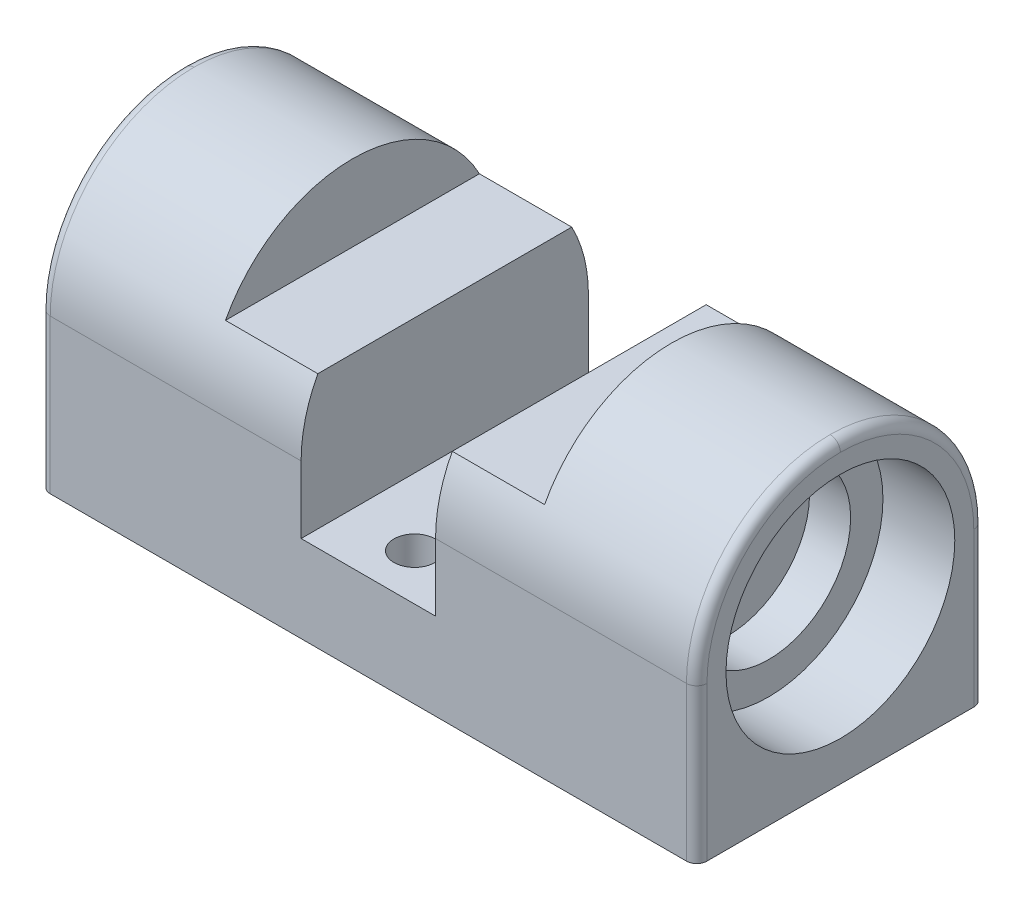
ISO-10303-21;
HEADER;
FILE_DESCRIPTION(('STEP AP214'),'2;1');
FILE_NAME('part.step','',(''),(''),'','','');
FILE_SCHEMA(('AUTOMOTIVE_DESIGN { 1 0 10303 214 1 1 1 1 }'));
ENDSEC;
DATA;
#1=APPLICATION_CONTEXT('core data for automotive mechanical design processes');
#2=APPLICATION_PROTOCOL_DEFINITION('international standard','automotive_design',2000,#1);
#3=PRODUCT_CONTEXT('',#1,'mechanical');
#4=PRODUCT('Part','Part','',(#3));
#5=PRODUCT_RELATED_PRODUCT_CATEGORY('part','',(#4));
#6=PRODUCT_DEFINITION_FORMATION('','',#4);
#7=PRODUCT_DEFINITION_CONTEXT('part definition',#1,'design');
#8=PRODUCT_DEFINITION('design','',#6,#7);
#9=PRODUCT_DEFINITION_SHAPE('','',#8);
#10=(LENGTH_UNIT() NAMED_UNIT(*) SI_UNIT(.MILLI.,.METRE.));
#11=(NAMED_UNIT(*) PLANE_ANGLE_UNIT() SI_UNIT($,.RADIAN.));
#12=(NAMED_UNIT(*) SI_UNIT($,.STERADIAN.) SOLID_ANGLE_UNIT());
#13=UNCERTAINTY_MEASURE_WITH_UNIT(LENGTH_MEASURE(1.E-05),#10,'distance_accuracy_value','');
#14=(GEOMETRIC_REPRESENTATION_CONTEXT(3) GLOBAL_UNCERTAINTY_ASSIGNED_CONTEXT((#13)) GLOBAL_UNIT_ASSIGNED_CONTEXT((#10,
#11,#12)) REPRESENTATION_CONTEXT('',''));
#15=CARTESIAN_POINT('',(0.,0.,0.));
#16=DIRECTION('',(0.,0.,1.));
#17=DIRECTION('',(1.,0.,0.));
#18=AXIS2_PLACEMENT_3D('',#15,#16,#17);
#19=CARTESIAN_POINT('',(0.,13.,0.));
#20=DIRECTION('',(1.,0.,0.));
#21=DIRECTION('',(0.,0.,-1.));
#22=AXIS2_PLACEMENT_3D('',#19,#20,#21);
#23=CYLINDRICAL_SURFACE('',#22,14.);
#24=DIRECTION('',(-1.,0.,0.));
#25=VECTOR('',#24,1.);
#26=CARTESIAN_POINT('',(32.,13.,-14.));
#27=LINE('',#26,#25);
#28=CARTESIAN_POINT('',(6.55,13.,-14.));
#29=VERTEX_POINT('',#28);
#30=CARTESIAN_POINT('',(31.,13.,-14.));
#31=VERTEX_POINT('',#30);
#32=EDGE_CURVE('E255',#29,#31,#27,.F.);
#33=ORIENTED_EDGE('',*,*,#32,.F.);
#34=CARTESIAN_POINT('',(6.55,13.,0.));
#35=DIRECTION('',(-1.,0.,0.));
#36=DIRECTION('',(0.,-1.,0.));
#37=AXIS2_PLACEMENT_3D('',#34,#35,#36);
#38=CIRCLE('',#37,14.);
#39=CARTESIAN_POINT('',(6.55,19.55,-12.3732574530719));
#40=VERTEX_POINT('',#39);
#41=EDGE_CURVE('E348',#29,#40,#38,.F.);
#42=ORIENTED_EDGE('',*,*,#41,.T.);
#43=DIRECTION('',(1.,0.,0.));
#44=VECTOR('',#43,1.);
#45=CARTESIAN_POINT('',(0.,19.55,-12.3732574530719));
#46=LINE('',#45,#44);
#47=CARTESIAN_POINT('',(15.5472418092629,19.55,-12.3732574530719));
#48=VERTEX_POINT('',#47);
#49=EDGE_CURVE('E341',#40,#48,#46,.T.);
#50=ORIENTED_EDGE('',*,*,#49,.T.);
#51=CARTESIAN_POINT('',(15.5472418092629,13.,0.));
#52=DIRECTION('',(-1.,0.,0.));
#53=DIRECTION('',(0.,0.,1.));
#54=AXIS2_PLACEMENT_3D('',#51,#52,#53);
#55=CIRCLE('',#54,14.);
#56=CARTESIAN_POINT('',(15.5472418092629,19.55,12.3732574530719));
#57=VERTEX_POINT('',#56);
#58=EDGE_CURVE('E313',#48,#57,#55,.F.);
#59=ORIENTED_EDGE('',*,*,#58,.T.);
#60=DIRECTION('',(1.,0.,0.));
#61=VECTOR('',#60,1.);
#62=CARTESIAN_POINT('',(0.,19.55,12.3732574530719));
#63=LINE('',#62,#61);
#64=CARTESIAN_POINT('',(6.55,19.55,12.3732574530719));
#65=VERTEX_POINT('',#64);
#66=EDGE_CURVE('E344',#57,#65,#63,.F.);
#67=ORIENTED_EDGE('',*,*,#66,.T.);
#68=CARTESIAN_POINT('',(6.55,13.,14.));
#69=VERTEX_POINT('',#68);
#70=EDGE_CURVE('E347',#65,#69,#38,.F.);
#71=ORIENTED_EDGE('',*,*,#70,.T.);
#72=DIRECTION('',(1.,0.,0.));
#73=VECTOR('',#72,1.);
#74=CARTESIAN_POINT('',(-32.,13.,14.));
#75=LINE('',#74,#73);
#76=CARTESIAN_POINT('',(31.,13.,14.));
#77=VERTEX_POINT('',#76);
#78=EDGE_CURVE('E59',#77,#69,#75,.F.);
#79=ORIENTED_EDGE('',*,*,#78,.F.);
#80=CARTESIAN_POINT('',(31.,13.,0.));
#81=DIRECTION('',(-1.,0.,0.));
#82=DIRECTION('',(0.,0.,1.));
#83=AXIS2_PLACEMENT_3D('',#80,#81,#82);
#84=CIRCLE('',#83,14.);
#85=CARTESIAN_POINT('',(31.,27.,0.));
#86=VERTEX_POINT('',#85);
#87=EDGE_CURVE('E306',#77,#86,#84,.T.);
#88=ORIENTED_EDGE('',*,*,#87,.T.);
#89=DIRECTION('',(1.,0.,0.));
#90=VECTOR('',#89,1.);
#91=CARTESIAN_POINT('',(32.,27.,0.));
#92=LINE('',#91,#90);
#93=CARTESIAN_POINT('',(21.25,27.,0.));
#94=VERTEX_POINT('',#93);
#95=EDGE_CURVE('E262',#94,#86,#92,.T.);
#96=ORIENTED_EDGE('',*,*,#95,.F.);
#97=ORIENTED_EDGE('',*,*,#95,.T.);
#98=CARTESIAN_POINT('',(31.,13.,0.));
#99=DIRECTION('',(-1.,0.,0.));
#100=DIRECTION('',(0.,0.,1.));
#101=AXIS2_PLACEMENT_3D('',#98,#99,#100);
#102=CIRCLE('',#101,14.);
#103=EDGE_CURVE('E303',#86,#31,#102,.T.);
#104=ORIENTED_EDGE('',*,*,#103,.T.);
#105=EDGE_LOOP('',(#33,#42,#50,#59,#67,#71,#79,#88,#96,#97,#104));
#106=FACE_BOUND('',#105,.T.);
#107=ADVANCED_FACE('F35',(#106),#23,.T.);
#108=CARTESIAN_POINT('',(-32.,13.,0.));
#109=DIRECTION('',(1.,0.,0.));
#110=DIRECTION('',(0.,0.,-1.));
#111=AXIS2_PLACEMENT_3D('',#108,#109,#110);
#112=CYLINDRICAL_SURFACE('',#111,8.);
#113=CARTESIAN_POINT('',(-21.,13.,0.));
#114=DIRECTION('',(-1.,0.,0.));
#115=DIRECTION('',(0.,0.,1.));
#116=AXIS2_PLACEMENT_3D('',#113,#114,#115);
#117=CIRCLE('',#116,8.);
#118=CARTESIAN_POINT('',(-21.,13.,8.00000000000001));
#119=VERTEX_POINT('',#118);
#120=EDGE_CURVE('E229',#119,#119,#117,.F.);
#121=ORIENTED_EDGE('',*,*,#120,.T.);
#122=EDGE_LOOP('',(#121));
#123=FACE_BOUND('',#122,.T.);
#124=CARTESIAN_POINT('',(-25.,13.,0.));
#125=DIRECTION('',(-1.,0.,0.));
#126=DIRECTION('',(0.,0.,1.));
#127=AXIS2_PLACEMENT_3D('',#124,#125,#126);
#128=CIRCLE('',#127,8.);
#129=CARTESIAN_POINT('',(-25.,13.,8.00000000000001));
#130=VERTEX_POINT('',#129);
#131=EDGE_CURVE('E228',#130,#130,#128,.T.);
#132=ORIENTED_EDGE('',*,*,#131,.T.);
#133=EDGE_LOOP('',(#132));
#134=FACE_BOUND('',#133,.T.);
#135=ADVANCED_FACE('F379',(#123,#134),#112,.F.);
#136=CARTESIAN_POINT('',(0.,-2.,0.));
#137=DIRECTION('',(0.,-1.,0.));
#138=DIRECTION('',(0.,0.,-1.));
#139=AXIS2_PLACEMENT_3D('',#136,#137,#138);
#140=PLANE('',#139);
#141=CARTESIAN_POINT('',(0.,-2.,-9.5));
#142=DIRECTION('',(0.,-1.,0.));
#143=DIRECTION('',(0.,0.,-1.));
#144=AXIS2_PLACEMENT_3D('',#141,#142,#143);
#145=CIRCLE('',#144,2.);
#146=CARTESIAN_POINT('',(0.,-2.,-11.5));
#147=VERTEX_POINT('',#146);
#148=EDGE_CURVE('E216',#147,#147,#145,.T.);
#149=ORIENTED_EDGE('',*,*,#148,.F.);
#150=EDGE_LOOP('',(#149));
#151=FACE_BOUND('',#150,.T.);
#152=CARTESIAN_POINT('',(0.,-2.,9.5));
#153=DIRECTION('',(0.,-1.,0.));
#154=DIRECTION('',(0.,0.,-1.));
#155=AXIS2_PLACEMENT_3D('',#152,#153,#154);
#156=CIRCLE('',#155,2.);
#157=CARTESIAN_POINT('',(0.,-2.,7.5));
#158=VERTEX_POINT('',#157);
#159=EDGE_CURVE('E220',#158,#158,#156,.T.);
#160=ORIENTED_EDGE('',*,*,#159,.F.);
#161=EDGE_LOOP('',(#160));
#162=FACE_BOUND('',#161,.T.);
#163=CARTESIAN_POINT('',(0.,-2.,0.));
#164=DIRECTION('',(0.,-1.,0.));
#165=DIRECTION('',(0.,0.,-1.));
#166=AXIS2_PLACEMENT_3D('',#163,#164,#165);
#167=CIRCLE('',#166,2.);
#168=CARTESIAN_POINT('',(0.,-2.,-2.));
#169=VERTEX_POINT('',#168);
#170=EDGE_CURVE('E215',#169,#169,#167,.T.);
#171=ORIENTED_EDGE('',*,*,#170,.F.);
#172=EDGE_LOOP('',(#171));
#173=FACE_BOUND('',#172,.T.);
#174=CARTESIAN_POINT('',(31.,-2.,13.));
#175=DIRECTION('',(0.,-1.,0.));
#176=DIRECTION('',(0.,0.,-1.));
#177=AXIS2_PLACEMENT_3D('',#174,#175,#176);
#178=CIRCLE('',#177,1.);
#179=CARTESIAN_POINT('',(32.,-2.,13.));
#180=VERTEX_POINT('',#179);
#181=CARTESIAN_POINT('',(31.,-2.,14.));
#182=VERTEX_POINT('',#181);
#183=EDGE_CURVE('E274',#180,#182,#178,.T.);
#184=ORIENTED_EDGE('',*,*,#183,.T.);
#185=DIRECTION('',(1.,0.,0.));
#186=VECTOR('',#185,1.);
#187=CARTESIAN_POINT('',(21.25,-2.,14.));
#188=LINE('',#187,#186);
#189=CARTESIAN_POINT('',(-31.,-2.,14.));
#190=VERTEX_POINT('',#189);
#191=EDGE_CURVE('E241',#190,#182,#188,.T.);
#192=ORIENTED_EDGE('',*,*,#191,.F.);
#193=CARTESIAN_POINT('',(-31.,-2.,13.));
#194=DIRECTION('',(0.,-1.,0.));
#195=DIRECTION('',(0.,0.,-1.));
#196=AXIS2_PLACEMENT_3D('',#193,#194,#195);
#197=CIRCLE('',#196,1.);
#198=CARTESIAN_POINT('',(-32.,-2.,13.));
#199=VERTEX_POINT('',#198);
#200=EDGE_CURVE('E277',#190,#199,#197,.T.);
#201=ORIENTED_EDGE('',*,*,#200,.T.);
#202=DIRECTION('',(0.,0.,1.));
#203=VECTOR('',#202,1.);
#204=CARTESIAN_POINT('',(-32.,-2.,-14.));
#205=LINE('',#204,#203);
#206=CARTESIAN_POINT('',(-32.,-2.,-13.));
#207=VERTEX_POINT('',#206);
#208=EDGE_CURVE('E250',#207,#199,#205,.T.);
#209=ORIENTED_EDGE('',*,*,#208,.F.);
#210=CARTESIAN_POINT('',(-31.,-2.,-13.));
#211=DIRECTION('',(0.,-1.,0.));
#212=DIRECTION('',(0.,0.,-1.));
#213=AXIS2_PLACEMENT_3D('',#210,#211,#212);
#214=CIRCLE('',#213,1.);
#215=CARTESIAN_POINT('',(-31.,-2.,-14.));
#216=VERTEX_POINT('',#215);
#217=EDGE_CURVE('E281',#207,#216,#214,.T.);
#218=ORIENTED_EDGE('',*,*,#217,.T.);
#219=DIRECTION('',(-1.,0.,0.));
#220=VECTOR('',#219,1.);
#221=CARTESIAN_POINT('',(-32.,-2.,-14.));
#222=LINE('',#221,#220);
#223=CARTESIAN_POINT('',(31.,-2.,-14.));
#224=VERTEX_POINT('',#223);
#225=EDGE_CURVE('E247',#224,#216,#222,.T.);
#226=ORIENTED_EDGE('',*,*,#225,.F.);
#227=CARTESIAN_POINT('',(31.,-2.,-13.));
#228=DIRECTION('',(0.,-1.,0.));
#229=DIRECTION('',(0.,0.,-1.));
#230=AXIS2_PLACEMENT_3D('',#227,#228,#229);
#231=CIRCLE('',#230,1.);
#232=CARTESIAN_POINT('',(32.,-2.,-13.));
#233=VERTEX_POINT('',#232);
#234=EDGE_CURVE('E279',#224,#233,#231,.T.);
#235=ORIENTED_EDGE('',*,*,#234,.T.);
#236=DIRECTION('',(0.,0.,-1.));
#237=VECTOR('',#236,1.);
#238=CARTESIAN_POINT('',(32.,-2.,-14.));
#239=LINE('',#238,#237);
#240=EDGE_CURVE('E244',#180,#233,#239,.T.);
#241=ORIENTED_EDGE('',*,*,#240,.F.);
#242=EDGE_LOOP('',(#184,#192,#201,#209,#218,#226,#235,#241));
#243=FACE_BOUND('',#242,.T.);
#244=ADVANCED_FACE('F384',(#151,#162,#173,#243),#140,.T.);
#245=CARTESIAN_POINT('',(-32.,27.,-14.));
#246=DIRECTION('',(0.,0.,1.));
#247=DIRECTION('',(1.,0.,0.));
#248=AXIS2_PLACEMENT_3D('',#245,#246,#247);
#249=PLANE('',#248);
#250=CARTESIAN_POINT('',(-31.,13.,-14.));
#251=VERTEX_POINT('',#250);
#252=CARTESIAN_POINT('',(-6.55,13.,-14.));
#253=VERTEX_POINT('',#252);
#254=EDGE_CURVE('E256',#251,#253,#27,.F.);
#255=ORIENTED_EDGE('',*,*,#254,.T.);
#256=DIRECTION('',(0.,1.,0.));
#257=VECTOR('',#256,1.);
#258=CARTESIAN_POINT('',(-6.55,0.,-14.));
#259=LINE('',#258,#257);
#260=CARTESIAN_POINT('',(-6.55,6.45,-14.));
#261=VERTEX_POINT('',#260);
#262=EDGE_CURVE('E190',#261,#253,#259,.T.);
#263=ORIENTED_EDGE('',*,*,#262,.F.);
#264=DIRECTION('',(-1.,0.,0.));
#265=VECTOR('',#264,1.);
#266=CARTESIAN_POINT('',(0.,6.45,-14.));
#267=LINE('',#266,#265);
#268=CARTESIAN_POINT('',(6.55,6.45,-14.));
#269=VERTEX_POINT('',#268);
#270=EDGE_CURVE('E192',#269,#261,#267,.T.);
#271=ORIENTED_EDGE('',*,*,#270,.F.);
#272=DIRECTION('',(0.,1.,0.));
#273=VECTOR('',#272,1.);
#274=CARTESIAN_POINT('',(6.55,0.,-14.));
#275=LINE('',#274,#273);
#276=EDGE_CURVE('E173',#269,#29,#275,.T.);
#277=ORIENTED_EDGE('',*,*,#276,.T.);
#278=ORIENTED_EDGE('',*,*,#32,.T.);
#279=DIRECTION('',(0.,-1.,0.));
#280=VECTOR('',#279,1.);
#281=CARTESIAN_POINT('',(31.,27.,-14.));
#282=LINE('',#281,#280);
#283=EDGE_CURVE('E292',#31,#224,#282,.T.);
#284=ORIENTED_EDGE('',*,*,#283,.T.);
#285=ORIENTED_EDGE('',*,*,#225,.T.);
#286=DIRECTION('',(0.,-1.,0.));
#287=VECTOR('',#286,1.);
#288=CARTESIAN_POINT('',(-31.,27.,-14.));
#289=LINE('',#288,#287);
#290=EDGE_CURVE('E284',#216,#251,#289,.F.);
#291=ORIENTED_EDGE('',*,*,#290,.T.);
#292=EDGE_LOOP('',(#255,#263,#271,#277,#278,#284,#285,#291));
#293=FACE_BOUND('',#292,.T.);
#294=ADVANCED_FACE('F430',(#293),#249,.F.);
#295=CARTESIAN_POINT('',(-32.,27.,-14.));
#296=DIRECTION('',(1.,0.,0.));
#297=DIRECTION('',(0.,0.,-1.));
#298=AXIS2_PLACEMENT_3D('',#295,#296,#297);
#299=PLANE('',#298);
#300=CARTESIAN_POINT('',(-32.,13.,0.));
#301=DIRECTION('',(-1.,0.,0.));
#302=DIRECTION('',(0.,0.,1.));
#303=AXIS2_PLACEMENT_3D('',#300,#301,#302);
#304=CIRCLE('',#303,11.15);
#305=CARTESIAN_POINT('',(-32.,13.,11.15));
#306=VERTEX_POINT('',#305);
#307=EDGE_CURVE('E234',#306,#306,#304,.T.);
#308=ORIENTED_EDGE('',*,*,#307,.F.);
#309=EDGE_LOOP('',(#308));
#310=FACE_BOUND('',#309,.T.);
#311=CARTESIAN_POINT('',(-32.,13.,0.));
#312=DIRECTION('',(1.,0.,0.));
#313=DIRECTION('',(0.,0.,-1.));
#314=AXIS2_PLACEMENT_3D('',#311,#312,#313);
#315=CIRCLE('',#314,13.);
#316=CARTESIAN_POINT('',(-32.,26.,0.));
#317=VERTEX_POINT('',#316);
#318=CARTESIAN_POINT('',(-32.,13.,-13.));
#319=VERTEX_POINT('',#318);
#320=EDGE_CURVE('E269',#317,#319,#315,.F.);
#321=ORIENTED_EDGE('',*,*,#320,.T.);
#322=DIRECTION('',(0.,-1.,0.));
#323=VECTOR('',#322,1.);
#324=CARTESIAN_POINT('',(-32.,27.,-13.));
#325=LINE('',#324,#323);
#326=EDGE_CURVE('E271',#319,#207,#325,.T.);
#327=ORIENTED_EDGE('',*,*,#326,.T.);
#328=ORIENTED_EDGE('',*,*,#208,.T.);
#329=DIRECTION('',(0.,-1.,0.));
#330=VECTOR('',#329,1.);
#331=CARTESIAN_POINT('',(-32.,27.,13.));
#332=LINE('',#331,#330);
#333=CARTESIAN_POINT('',(-32.,13.,13.));
#334=VERTEX_POINT('',#333);
#335=EDGE_CURVE('E259',#199,#334,#332,.F.);
#336=ORIENTED_EDGE('',*,*,#335,.T.);
#337=CARTESIAN_POINT('',(-32.,13.,0.));
#338=DIRECTION('',(1.,0.,0.));
#339=DIRECTION('',(0.,0.,-1.));
#340=AXIS2_PLACEMENT_3D('',#337,#338,#339);
#341=CIRCLE('',#340,13.);
#342=EDGE_CURVE('E267',#334,#317,#341,.F.);
#343=ORIENTED_EDGE('',*,*,#342,.T.);
#344=EDGE_LOOP('',(#321,#327,#328,#336,#343));
#345=FACE_BOUND('',#344,.T.);
#346=ADVANCED_FACE('F427',(#310,#345),#299,.F.);
#347=CARTESIAN_POINT('',(-32.,27.,14.));
#348=DIRECTION('',(0.,0.,-1.));
#349=DIRECTION('',(-1.,0.,0.));
#350=AXIS2_PLACEMENT_3D('',#347,#348,#349);
#351=PLANE('',#350);
#352=DIRECTION('',(-1.,0.,0.));
#353=VECTOR('',#352,1.);
#354=CARTESIAN_POINT('',(0.,6.45,14.));
#355=LINE('',#354,#353);
#356=CARTESIAN_POINT('',(6.55,6.45,14.));
#357=VERTEX_POINT('',#356);
#358=CARTESIAN_POINT('',(-6.55,6.45,14.));
#359=VERTEX_POINT('',#358);
#360=EDGE_CURVE('E181',#357,#359,#355,.T.);
#361=ORIENTED_EDGE('',*,*,#360,.T.);
#362=DIRECTION('',(0.,1.,0.));
#363=VECTOR('',#362,1.);
#364=CARTESIAN_POINT('',(-6.55,0.,14.));
#365=LINE('',#364,#363);
#366=CARTESIAN_POINT('',(-6.55,13.,14.));
#367=VERTEX_POINT('',#366);
#368=EDGE_CURVE('E187',#359,#367,#365,.T.);
#369=ORIENTED_EDGE('',*,*,#368,.T.);
#370=CARTESIAN_POINT('',(-31.,13.,14.));
#371=VERTEX_POINT('',#370);
#372=EDGE_CURVE('E253',#367,#371,#75,.F.);
#373=ORIENTED_EDGE('',*,*,#372,.T.);
#374=DIRECTION('',(0.,-1.,0.));
#375=VECTOR('',#374,1.);
#376=CARTESIAN_POINT('',(-31.,27.,14.));
#377=LINE('',#376,#375);
#378=EDGE_CURVE('E308',#371,#190,#377,.T.);
#379=ORIENTED_EDGE('',*,*,#378,.T.);
#380=ORIENTED_EDGE('',*,*,#191,.T.);
#381=DIRECTION('',(0.,-1.,0.));
#382=VECTOR('',#381,1.);
#383=CARTESIAN_POINT('',(31.,27.,14.));
#384=LINE('',#383,#382);
#385=EDGE_CURVE('E311',#182,#77,#384,.F.);
#386=ORIENTED_EDGE('',*,*,#385,.T.);
#387=ORIENTED_EDGE('',*,*,#78,.T.);
#388=DIRECTION('',(0.,1.,0.));
#389=VECTOR('',#388,1.);
#390=CARTESIAN_POINT('',(6.55,0.,14.));
#391=LINE('',#390,#389);
#392=EDGE_CURVE('E171',#357,#69,#391,.T.);
#393=ORIENTED_EDGE('',*,*,#392,.F.);
#394=EDGE_LOOP('',(#361,#369,#373,#379,#380,#386,#387,#393));
#395=FACE_BOUND('',#394,.T.);
#396=ADVANCED_FACE('F189',(#395),#351,.F.);
#397=CARTESIAN_POINT('',(32.,27.,-14.));
#398=DIRECTION('',(-1.,0.,0.));
#399=DIRECTION('',(0.,0.,1.));
#400=AXIS2_PLACEMENT_3D('',#397,#398,#399);
#401=PLANE('',#400);
#402=CARTESIAN_POINT('',(32.,13.,0.));
#403=DIRECTION('',(1.,0.,0.));
#404=DIRECTION('',(0.,0.,-1.));
#405=AXIS2_PLACEMENT_3D('',#402,#403,#404);
#406=CIRCLE('',#405,11.15);
#407=CARTESIAN_POINT('',(32.,13.,-11.15));
#408=VERTEX_POINT('',#407);
#409=EDGE_CURVE('E233',#408,#408,#406,.T.);
#410=ORIENTED_EDGE('',*,*,#409,.F.);
#411=EDGE_LOOP('',(#410));
#412=FACE_BOUND('',#411,.T.);
#413=ORIENTED_EDGE('',*,*,#240,.T.);
#414=DIRECTION('',(0.,-1.,0.));
#415=VECTOR('',#414,1.);
#416=CARTESIAN_POINT('',(32.,27.,-13.));
#417=LINE('',#416,#415);
#418=CARTESIAN_POINT('',(32.,13.,-13.));
#419=VERTEX_POINT('',#418);
#420=EDGE_CURVE('E301',#233,#419,#417,.F.);
#421=ORIENTED_EDGE('',*,*,#420,.T.);
#422=CARTESIAN_POINT('',(32.,13.,0.));
#423=DIRECTION('',(-1.,0.,0.));
#424=DIRECTION('',(0.,0.,1.));
#425=AXIS2_PLACEMENT_3D('',#422,#423,#424);
#426=CIRCLE('',#425,13.);
#427=CARTESIAN_POINT('',(32.,26.,0.));
#428=VERTEX_POINT('',#427);
#429=EDGE_CURVE('E299',#419,#428,#426,.F.);
#430=ORIENTED_EDGE('',*,*,#429,.T.);
#431=CARTESIAN_POINT('',(32.,13.,0.));
#432=DIRECTION('',(-1.,0.,0.));
#433=DIRECTION('',(0.,0.,1.));
#434=AXIS2_PLACEMENT_3D('',#431,#432,#433);
#435=CIRCLE('',#434,13.);
#436=CARTESIAN_POINT('',(32.,13.,13.));
#437=VERTEX_POINT('',#436);
#438=EDGE_CURVE('E297',#428,#437,#435,.F.);
#439=ORIENTED_EDGE('',*,*,#438,.T.);
#440=DIRECTION('',(0.,-1.,0.));
#441=VECTOR('',#440,1.);
#442=CARTESIAN_POINT('',(32.,27.,13.));
#443=LINE('',#442,#441);
#444=EDGE_CURVE('E295',#437,#180,#443,.T.);
#445=ORIENTED_EDGE('',*,*,#444,.T.);
#446=EDGE_LOOP('',(#413,#421,#430,#439,#445));
#447=FACE_BOUND('',#446,.T.);
#448=ADVANCED_FACE('F420',(#412,#447),#401,.F.);
#449=CARTESIAN_POINT('',(25.,13.,0.));
#450=DIRECTION('',(1.,0.,0.));
#451=DIRECTION('',(0.,0.,-1.));
#452=AXIS2_PLACEMENT_3D('',#449,#450,#451);
#453=CYLINDRICAL_SURFACE('',#452,11.15);
#454=CARTESIAN_POINT('',(25.,13.,0.));
#455=DIRECTION('',(1.,0.,0.));
#456=DIRECTION('',(0.,0.,-1.));
#457=AXIS2_PLACEMENT_3D('',#454,#455,#456);
#458=CIRCLE('',#457,11.15);
#459=CARTESIAN_POINT('',(25.,13.,-11.15));
#460=VERTEX_POINT('',#459);
#461=EDGE_CURVE('E238',#460,#460,#458,.T.);
#462=ORIENTED_EDGE('',*,*,#461,.F.);
#463=EDGE_LOOP('',(#462));
#464=FACE_BOUND('',#463,.T.);
#465=ORIENTED_EDGE('',*,*,#409,.T.);
#466=EDGE_LOOP('',(#465));
#467=FACE_BOUND('',#466,.T.);
#468=ADVANCED_FACE('F416',(#464,#467),#453,.F.);
#469=CARTESIAN_POINT('',(25.,13.,0.));
#470=DIRECTION('',(1.,0.,0.));
#471=DIRECTION('',(0.,0.,-1.));
#472=AXIS2_PLACEMENT_3D('',#469,#470,#471);
#473=PLANE('',#472);
#474=CARTESIAN_POINT('',(25.,13.,0.));
#475=DIRECTION('',(1.,0.,0.));
#476=DIRECTION('',(0.,0.,-1.));
#477=AXIS2_PLACEMENT_3D('',#474,#475,#476);
#478=CIRCLE('',#477,8.);
#479=CARTESIAN_POINT('',(25.,13.,-8.00000000000001));
#480=VERTEX_POINT('',#479);
#481=EDGE_CURVE('E225',#480,#480,#478,.T.);
#482=ORIENTED_EDGE('',*,*,#481,.F.);
#483=EDGE_LOOP('',(#482));
#484=FACE_BOUND('',#483,.T.);
#485=ORIENTED_EDGE('',*,*,#461,.T.);
#486=EDGE_LOOP('',(#485));
#487=FACE_BOUND('',#486,.T.);
#488=ADVANCED_FACE('F407',(#484,#487),#473,.T.);
#489=CARTESIAN_POINT('',(-25.,13.,0.));
#490=DIRECTION('',(-1.,0.,0.));
#491=DIRECTION('',(0.,0.,1.));
#492=AXIS2_PLACEMENT_3D('',#489,#490,#491);
#493=CYLINDRICAL_SURFACE('',#492,11.15);
#494=CARTESIAN_POINT('',(-25.,13.,0.));
#495=DIRECTION('',(-1.,0.,0.));
#496=DIRECTION('',(0.,0.,1.));
#497=AXIS2_PLACEMENT_3D('',#494,#495,#496);
#498=CIRCLE('',#497,11.15);
#499=CARTESIAN_POINT('',(-25.,13.,11.15));
#500=VERTEX_POINT('',#499);
#501=EDGE_CURVE('E230',#500,#500,#498,.T.);
#502=ORIENTED_EDGE('',*,*,#501,.F.);
#503=EDGE_LOOP('',(#502));
#504=FACE_BOUND('',#503,.T.);
#505=ORIENTED_EDGE('',*,*,#307,.T.);
#506=EDGE_LOOP('',(#505));
#507=FACE_BOUND('',#506,.T.);
#508=ADVANCED_FACE('F401',(#504,#507),#493,.F.);
#509=CARTESIAN_POINT('',(-25.,13.,0.));
#510=DIRECTION('',(-1.,0.,0.));
#511=DIRECTION('',(0.,0.,1.));
#512=AXIS2_PLACEMENT_3D('',#509,#510,#511);
#513=PLANE('',#512);
#514=ORIENTED_EDGE('',*,*,#131,.F.);
#515=EDGE_LOOP('',(#514));
#516=FACE_BOUND('',#515,.T.);
#517=ORIENTED_EDGE('',*,*,#501,.T.);
#518=EDGE_LOOP('',(#517));
#519=FACE_BOUND('',#518,.T.);
#520=ADVANCED_FACE('F393',(#516,#519),#513,.T.);
#521=CARTESIAN_POINT('',(-6.55,13.,0.));
#522=DIRECTION('',(-1.,0.,0.));
#523=DIRECTION('',(0.,-1.,0.));
#524=AXIS2_PLACEMENT_3D('',#521,#522,#523);
#525=CIRCLE('',#524,14.);
#526=CARTESIAN_POINT('',(-6.55,19.55,-12.3732574530719));
#527=VERTEX_POINT('',#526);
#528=EDGE_CURVE('E12',#253,#527,#525,.F.);
#529=ORIENTED_EDGE('',*,*,#528,.F.);
#530=ORIENTED_EDGE('',*,*,#254,.F.);
#531=CARTESIAN_POINT('',(-31.,13.,0.));
#532=DIRECTION('',(1.,0.,0.));
#533=DIRECTION('',(0.,0.,-1.));
#534=AXIS2_PLACEMENT_3D('',#531,#532,#533);
#535=CIRCLE('',#534,14.);
#536=CARTESIAN_POINT('',(-31.,27.,0.));
#537=VERTEX_POINT('',#536);
#538=EDGE_CURVE('E287',#251,#537,#535,.T.);
#539=ORIENTED_EDGE('',*,*,#538,.T.);
#540=DIRECTION('',(-1.,0.,0.));
#541=VECTOR('',#540,1.);
#542=CARTESIAN_POINT('',(-32.,27.,0.));
#543=LINE('',#542,#541);
#544=CARTESIAN_POINT('',(-21.25,27.,0.));
#545=VERTEX_POINT('',#544);
#546=EDGE_CURVE('E237',#545,#537,#543,.T.);
#547=ORIENTED_EDGE('',*,*,#546,.F.);
#548=ORIENTED_EDGE('',*,*,#546,.T.);
#549=CARTESIAN_POINT('',(-31.,13.,0.));
#550=DIRECTION('',(1.,0.,0.));
#551=DIRECTION('',(0.,0.,-1.));
#552=AXIS2_PLACEMENT_3D('',#549,#550,#551);
#553=CIRCLE('',#552,14.);
#554=EDGE_CURVE('E289',#537,#371,#553,.T.);
#555=ORIENTED_EDGE('',*,*,#554,.T.);
#556=ORIENTED_EDGE('',*,*,#372,.F.);
#557=CARTESIAN_POINT('',(-6.55,19.55,12.3732574530719));
#558=VERTEX_POINT('',#557);
#559=EDGE_CURVE('E45',#558,#367,#525,.F.);
#560=ORIENTED_EDGE('',*,*,#559,.F.);
#561=DIRECTION('',(1.,0.,0.));
#562=VECTOR('',#561,1.);
#563=CARTESIAN_POINT('',(0.,19.55,12.3732574530719));
#564=LINE('',#563,#562);
#565=CARTESIAN_POINT('',(-15.5472418092629,19.55,12.3732574530719));
#566=VERTEX_POINT('',#565);
#567=EDGE_CURVE('E350',#558,#566,#564,.F.);
#568=ORIENTED_EDGE('',*,*,#567,.T.);
#569=CARTESIAN_POINT('',(-15.5472418092629,13.,0.));
#570=DIRECTION('',(1.,0.,0.));
#571=DIRECTION('',(0.,1.,0.));
#572=AXIS2_PLACEMENT_3D('',#569,#570,#571);
#573=CIRCLE('',#572,14.);
#574=CARTESIAN_POINT('',(-15.5472418092629,19.55,-12.3732574530719));
#575=VERTEX_POINT('',#574);
#576=EDGE_CURVE('E352',#566,#575,#573,.F.);
#577=ORIENTED_EDGE('',*,*,#576,.T.);
#578=DIRECTION('',(1.,0.,0.));
#579=VECTOR('',#578,1.);
#580=CARTESIAN_POINT('',(0.,19.55,-12.3732574530719));
#581=LINE('',#580,#579);
#582=EDGE_CURVE('E39',#575,#527,#581,.T.);
#583=ORIENTED_EDGE('',*,*,#582,.T.);
#584=EDGE_LOOP('',(#529,#530,#539,#547,#548,#555,#556,#560,#568,#577,#583));
#585=FACE_BOUND('',#584,.T.);
#586=ADVANCED_FACE('F357',(#585),#23,.T.);
#587=CARTESIAN_POINT('',(-31.,27.,13.));
#588=DIRECTION('',(0.,-1.,0.));
#589=DIRECTION('',(0.,0.,-1.));
#590=AXIS2_PLACEMENT_3D('',#587,#588,#589);
#591=CYLINDRICAL_SURFACE('',#590,1.);
#592=ORIENTED_EDGE('',*,*,#200,.F.);
#593=ORIENTED_EDGE('',*,*,#378,.F.);
#594=CARTESIAN_POINT('',(-31.,13.,13.));
#595=DIRECTION('',(0.,1.,0.));
#596=DIRECTION('',(0.,0.,1.));
#597=AXIS2_PLACEMENT_3D('',#594,#595,#596);
#598=CIRCLE('',#597,1.);
#599=EDGE_CURVE('E265',#334,#371,#598,.T.);
#600=ORIENTED_EDGE('',*,*,#599,.F.);
#601=ORIENTED_EDGE('',*,*,#335,.F.);
#602=EDGE_LOOP('',(#592,#593,#600,#601));
#603=FACE_BOUND('',#602,.T.);
#604=ADVANCED_FACE('F392',(#603),#591,.T.);
#605=CARTESIAN_POINT('',(-31.,13.,0.));
#606=DIRECTION('',(1.,0.,0.));
#607=DIRECTION('',(0.,0.,-1.));
#608=AXIS2_PLACEMENT_3D('',#605,#606,#607);
#609=TOROIDAL_SURFACE('',#608,13.,1.);
#610=ORIENTED_EDGE('',*,*,#599,.T.);
#611=ORIENTED_EDGE('',*,*,#554,.F.);
#612=CARTESIAN_POINT('',(-31.,26.,0.));
#613=DIRECTION('',(0.,0.,-1.));
#614=DIRECTION('',(-1.,0.,0.));
#615=AXIS2_PLACEMENT_3D('',#612,#613,#614);
#616=CIRCLE('',#615,1.);
#617=EDGE_CURVE('E317',#317,#537,#616,.T.);
#618=ORIENTED_EDGE('',*,*,#617,.F.);
#619=ORIENTED_EDGE('',*,*,#342,.F.);
#620=EDGE_LOOP('',(#610,#611,#618,#619));
#621=FACE_BOUND('',#620,.T.);
#622=ADVANCED_FACE('F398',(#621),#609,.T.);
#623=CARTESIAN_POINT('',(-31.,13.,0.));
#624=DIRECTION('',(1.,0.,0.));
#625=DIRECTION('',(0.,0.,-1.));
#626=AXIS2_PLACEMENT_3D('',#623,#624,#625);
#627=TOROIDAL_SURFACE('',#626,13.,1.);
#628=ORIENTED_EDGE('',*,*,#617,.T.);
#629=ORIENTED_EDGE('',*,*,#538,.F.);
#630=CARTESIAN_POINT('',(-31.,13.,-13.));
#631=DIRECTION('',(0.,-1.,0.));
#632=DIRECTION('',(0.,0.,-1.));
#633=AXIS2_PLACEMENT_3D('',#630,#631,#632);
#634=CIRCLE('',#633,1.);
#635=EDGE_CURVE('E314',#319,#251,#634,.T.);
#636=ORIENTED_EDGE('',*,*,#635,.F.);
#637=ORIENTED_EDGE('',*,*,#320,.F.);
#638=EDGE_LOOP('',(#628,#629,#636,#637));
#639=FACE_BOUND('',#638,.T.);
#640=ADVANCED_FACE('F491',(#639),#627,.T.);
#641=CARTESIAN_POINT('',(-31.,27.,-13.));
#642=DIRECTION('',(0.,-1.,0.));
#643=DIRECTION('',(0.,0.,-1.));
#644=AXIS2_PLACEMENT_3D('',#641,#642,#643);
#645=CYLINDRICAL_SURFACE('',#644,1.);
#646=ORIENTED_EDGE('',*,*,#635,.T.);
#647=ORIENTED_EDGE('',*,*,#290,.F.);
#648=ORIENTED_EDGE('',*,*,#217,.F.);
#649=ORIENTED_EDGE('',*,*,#326,.F.);
#650=EDGE_LOOP('',(#646,#647,#648,#649));
#651=FACE_BOUND('',#650,.T.);
#652=ADVANCED_FACE('F462',(#651),#645,.T.);
#653=CARTESIAN_POINT('',(31.,27.,13.));
#654=DIRECTION('',(0.,-1.,0.));
#655=DIRECTION('',(0.,0.,-1.));
#656=AXIS2_PLACEMENT_3D('',#653,#654,#655);
#657=CYLINDRICAL_SURFACE('',#656,1.);
#658=ORIENTED_EDGE('',*,*,#183,.F.);
#659=ORIENTED_EDGE('',*,*,#444,.F.);
#660=CARTESIAN_POINT('',(31.,13.,13.));
#661=DIRECTION('',(0.,1.,0.));
#662=DIRECTION('',(0.,0.,1.));
#663=AXIS2_PLACEMENT_3D('',#660,#661,#662);
#664=CIRCLE('',#663,1.);
#665=EDGE_CURVE('E318',#77,#437,#664,.T.);
#666=ORIENTED_EDGE('',*,*,#665,.F.);
#667=ORIENTED_EDGE('',*,*,#385,.F.);
#668=EDGE_LOOP('',(#658,#659,#666,#667));
#669=FACE_BOUND('',#668,.T.);
#670=ADVANCED_FACE('F37',(#669),#657,.T.);
#671=CARTESIAN_POINT('',(31.,13.,0.));
#672=DIRECTION('',(-1.,0.,0.));
#673=DIRECTION('',(0.,0.,1.));
#674=AXIS2_PLACEMENT_3D('',#671,#672,#673);
#675=TOROIDAL_SURFACE('',#674,13.,1.);
#676=ORIENTED_EDGE('',*,*,#665,.T.);
#677=ORIENTED_EDGE('',*,*,#438,.F.);
#678=CARTESIAN_POINT('',(31.,26.,0.));
#679=DIRECTION('',(0.,0.,-1.));
#680=DIRECTION('',(-1.,0.,0.));
#681=AXIS2_PLACEMENT_3D('',#678,#679,#680);
#682=CIRCLE('',#681,1.);
#683=EDGE_CURVE('E326',#86,#428,#682,.T.);
#684=ORIENTED_EDGE('',*,*,#683,.F.);
#685=ORIENTED_EDGE('',*,*,#87,.F.);
#686=EDGE_LOOP('',(#676,#677,#684,#685));
#687=FACE_BOUND('',#686,.T.);
#688=ADVANCED_FACE('F479',(#687),#675,.T.);
#689=CARTESIAN_POINT('',(31.,13.,0.));
#690=DIRECTION('',(-1.,0.,0.));
#691=DIRECTION('',(0.,0.,1.));
#692=AXIS2_PLACEMENT_3D('',#689,#690,#691);
#693=TOROIDAL_SURFACE('',#692,13.,1.);
#694=ORIENTED_EDGE('',*,*,#683,.T.);
#695=ORIENTED_EDGE('',*,*,#429,.F.);
#696=CARTESIAN_POINT('',(31.,13.,-13.));
#697=DIRECTION('',(0.,-1.,0.));
#698=DIRECTION('',(0.,0.,-1.));
#699=AXIS2_PLACEMENT_3D('',#696,#697,#698);
#700=CIRCLE('',#699,1.);
#701=EDGE_CURVE('E323',#31,#419,#700,.T.);
#702=ORIENTED_EDGE('',*,*,#701,.F.);
#703=ORIENTED_EDGE('',*,*,#103,.F.);
#704=EDGE_LOOP('',(#694,#695,#702,#703));
#705=FACE_BOUND('',#704,.T.);
#706=ADVANCED_FACE('F475',(#705),#693,.T.);
#707=CARTESIAN_POINT('',(31.,27.,-13.));
#708=DIRECTION('',(0.,-1.,0.));
#709=DIRECTION('',(0.,0.,-1.));
#710=AXIS2_PLACEMENT_3D('',#707,#708,#709);
#711=CYLINDRICAL_SURFACE('',#710,1.);
#712=ORIENTED_EDGE('',*,*,#701,.T.);
#713=ORIENTED_EDGE('',*,*,#420,.F.);
#714=ORIENTED_EDGE('',*,*,#234,.F.);
#715=ORIENTED_EDGE('',*,*,#283,.F.);
#716=EDGE_LOOP('',(#712,#713,#714,#715));
#717=FACE_BOUND('',#716,.T.);
#718=ADVANCED_FACE('F468',(#717),#711,.T.);
#719=CARTESIAN_POINT('',(21.,13.,0.));
#720=DIRECTION('',(1.,0.,0.));
#721=DIRECTION('',(0.,0.,-1.));
#722=AXIS2_PLACEMENT_3D('',#719,#720,#721);
#723=CIRCLE('',#722,8.);
#724=CARTESIAN_POINT('',(21.,13.,-8.00000000000001));
#725=VERTEX_POINT('',#724);
#726=EDGE_CURVE('E219',#725,#725,#723,.F.);
#727=ORIENTED_EDGE('',*,*,#726,.T.);
#728=EDGE_LOOP('',(#727));
#729=FACE_BOUND('',#728,.T.);
#730=ORIENTED_EDGE('',*,*,#481,.T.);
#731=EDGE_LOOP('',(#730));
#732=FACE_BOUND('',#731,.T.);
#733=ADVANCED_FACE('F387',(#729,#732),#112,.F.);
#734=CARTESIAN_POINT('',(21.,13.,0.));
#735=DIRECTION('',(1.,0.,0.));
#736=DIRECTION('',(0.,0.,-1.));
#737=AXIS2_PLACEMENT_3D('',#734,#735,#736);
#738=PLANE('',#737);
#739=ORIENTED_EDGE('',*,*,#726,.F.);
#740=EDGE_LOOP('',(#739));
#741=FACE_BOUND('',#740,.T.);
#742=ADVANCED_FACE('F550',(#741),#738,.T.);
#743=CARTESIAN_POINT('',(-21.,13.,0.));
#744=DIRECTION('',(-1.,0.,0.));
#745=DIRECTION('',(0.,0.,1.));
#746=AXIS2_PLACEMENT_3D('',#743,#744,#745);
#747=PLANE('',#746);
#748=ORIENTED_EDGE('',*,*,#120,.F.);
#749=EDGE_LOOP('',(#748));
#750=FACE_BOUND('',#749,.T.);
#751=ADVANCED_FACE('F559',(#750),#747,.T.);
#752=CARTESIAN_POINT('',(0.,27.,0.));
#753=DIRECTION('',(0.,-1.,0.));
#754=DIRECTION('',(0.,0.,-1.));
#755=AXIS2_PLACEMENT_3D('',#752,#753,#754);
#756=CYLINDRICAL_SURFACE('',#755,2.);
#757=CARTESIAN_POINT('',(0.,6.45,0.));
#758=DIRECTION('',(0.,-1.,0.));
#759=DIRECTION('',(0.,0.,-1.));
#760=AXIS2_PLACEMENT_3D('',#757,#758,#759);
#761=CIRCLE('',#760,2.);
#762=CARTESIAN_POINT('',(0.,6.45,-2.));
#763=VERTEX_POINT('',#762);
#764=EDGE_CURVE('E212',#763,#763,#761,.F.);
#765=ORIENTED_EDGE('',*,*,#764,.T.);
#766=EDGE_LOOP('',(#765));
#767=FACE_BOUND('',#766,.T.);
#768=ORIENTED_EDGE('',*,*,#170,.T.);
#769=EDGE_LOOP('',(#768));
#770=FACE_BOUND('',#769,.T.);
#771=ADVANCED_FACE('F568',(#767,#770),#756,.F.);
#772=CARTESIAN_POINT('',(0.,27.,9.5));
#773=DIRECTION('',(0.,-1.,0.));
#774=DIRECTION('',(0.,0.,-1.));
#775=AXIS2_PLACEMENT_3D('',#772,#773,#774);
#776=CYLINDRICAL_SURFACE('',#775,2.);
#777=CARTESIAN_POINT('',(0.,6.45,9.5));
#778=DIRECTION('',(0.,-1.,0.));
#779=DIRECTION('',(0.,0.,-1.));
#780=AXIS2_PLACEMENT_3D('',#777,#778,#779);
#781=CIRCLE('',#780,2.);
#782=CARTESIAN_POINT('',(0.,6.45,7.5));
#783=VERTEX_POINT('',#782);
#784=EDGE_CURVE('E209',#783,#783,#781,.F.);
#785=ORIENTED_EDGE('',*,*,#784,.T.);
#786=EDGE_LOOP('',(#785));
#787=FACE_BOUND('',#786,.T.);
#788=ORIENTED_EDGE('',*,*,#159,.T.);
#789=EDGE_LOOP('',(#788));
#790=FACE_BOUND('',#789,.T.);
#791=ADVANCED_FACE('F608',(#787,#790),#776,.F.);
#792=CARTESIAN_POINT('',(0.,27.,-9.5));
#793=DIRECTION('',(0.,-1.,0.));
#794=DIRECTION('',(0.,0.,-1.));
#795=AXIS2_PLACEMENT_3D('',#792,#793,#794);
#796=CYLINDRICAL_SURFACE('',#795,2.);
#797=CARTESIAN_POINT('',(0.,6.45,-9.5));
#798=DIRECTION('',(0.,-1.,0.));
#799=DIRECTION('',(0.,0.,-1.));
#800=AXIS2_PLACEMENT_3D('',#797,#798,#799);
#801=CIRCLE('',#800,2.);
#802=CARTESIAN_POINT('',(0.,6.45,-11.5));
#803=VERTEX_POINT('',#802);
#804=EDGE_CURVE('E201',#803,#803,#801,.F.);
#805=ORIENTED_EDGE('',*,*,#804,.T.);
#806=EDGE_LOOP('',(#805));
#807=FACE_BOUND('',#806,.T.);
#808=ORIENTED_EDGE('',*,*,#148,.T.);
#809=EDGE_LOOP('',(#808));
#810=FACE_BOUND('',#809,.T.);
#811=ADVANCED_FACE('F373',(#807,#810),#796,.F.);
#812=CARTESIAN_POINT('',(0.,6.45,14.));
#813=DIRECTION('',(0.,-1.,0.));
#814=DIRECTION('',(0.,0.,-1.));
#815=AXIS2_PLACEMENT_3D('',#812,#813,#814);
#816=PLANE('',#815);
#817=ORIENTED_EDGE('',*,*,#784,.F.);
#818=EDGE_LOOP('',(#817));
#819=FACE_BOUND('',#818,.T.);
#820=ORIENTED_EDGE('',*,*,#270,.T.);
#821=DIRECTION('',(0.,0.,-1.));
#822=VECTOR('',#821,1.);
#823=CARTESIAN_POINT('',(-6.55,6.45,14.));
#824=LINE('',#823,#822);
#825=EDGE_CURVE('E177',#359,#261,#824,.T.);
#826=ORIENTED_EDGE('',*,*,#825,.F.);
#827=ORIENTED_EDGE('',*,*,#360,.F.);
#828=DIRECTION('',(0.,0.,-1.));
#829=VECTOR('',#828,1.);
#830=CARTESIAN_POINT('',(6.55,6.45,14.));
#831=LINE('',#830,#829);
#832=EDGE_CURVE('E167',#357,#269,#831,.T.);
#833=ORIENTED_EDGE('',*,*,#832,.T.);
#834=EDGE_LOOP('',(#820,#826,#827,#833));
#835=FACE_BOUND('',#834,.T.);
#836=ORIENTED_EDGE('',*,*,#804,.F.);
#837=EDGE_LOOP('',(#836));
#838=FACE_BOUND('',#837,.T.);
#839=ORIENTED_EDGE('',*,*,#764,.F.);
#840=EDGE_LOOP('',(#839));
#841=FACE_BOUND('',#840,.T.);
#842=ADVANCED_FACE('F182',(#819,#835,#838,#841),#816,.F.);
#843=CARTESIAN_POINT('',(-15.5472418092629,0.,14.));
#844=DIRECTION('',(1.,0.,0.));
#845=DIRECTION('',(0.,1.,0.));
#846=AXIS2_PLACEMENT_3D('',#843,#844,#845);
#847=PLANE('',#846);
#848=DIRECTION('',(0.,0.,-1.));
#849=VECTOR('',#848,1.);
#850=CARTESIAN_POINT('',(-15.5472418092629,19.55,14.));
#851=LINE('',#850,#849);
#852=EDGE_CURVE('E198',#566,#575,#851,.T.);
#853=ORIENTED_EDGE('',*,*,#852,.T.);
#854=ORIENTED_EDGE('',*,*,#576,.F.);
#855=EDGE_LOOP('',(#853,#854));
#856=FACE_BOUND('',#855,.T.);
#857=ADVANCED_FACE('F363',(#856),#847,.T.);
#858=CARTESIAN_POINT('',(0.,19.55,14.));
#859=DIRECTION('',(0.,1.,0.));
#860=DIRECTION('',(-1.,0.,0.));
#861=AXIS2_PLACEMENT_3D('',#858,#859,#860);
#862=PLANE('',#861);
#863=DIRECTION('',(0.,0.,-1.));
#864=VECTOR('',#863,1.);
#865=CARTESIAN_POINT('',(-6.55,19.55,14.));
#866=LINE('',#865,#864);
#867=EDGE_CURVE('E202',#558,#527,#866,.T.);
#868=ORIENTED_EDGE('',*,*,#867,.T.);
#869=ORIENTED_EDGE('',*,*,#582,.F.);
#870=ORIENTED_EDGE('',*,*,#852,.F.);
#871=ORIENTED_EDGE('',*,*,#567,.F.);
#872=EDGE_LOOP('',(#868,#869,#870,#871));
#873=FACE_BOUND('',#872,.T.);
#874=ADVANCED_FACE('F360',(#873),#862,.T.);
#875=CARTESIAN_POINT('',(-6.55,0.,14.));
#876=DIRECTION('',(-1.,0.,0.));
#877=DIRECTION('',(0.,-1.,0.));
#878=AXIS2_PLACEMENT_3D('',#875,#876,#877);
#879=PLANE('',#878);
#880=ORIENTED_EDGE('',*,*,#528,.T.);
#881=ORIENTED_EDGE('',*,*,#867,.F.);
#882=ORIENTED_EDGE('',*,*,#559,.T.);
#883=ORIENTED_EDGE('',*,*,#368,.F.);
#884=ORIENTED_EDGE('',*,*,#825,.T.);
#885=ORIENTED_EDGE('',*,*,#262,.T.);
#886=EDGE_LOOP('',(#880,#881,#882,#883,#884,#885));
#887=FACE_BOUND('',#886,.T.);
#888=ADVANCED_FACE('F370',(#887),#879,.F.);
#889=CARTESIAN_POINT('',(6.55,0.,14.));
#890=DIRECTION('',(-1.,0.,0.));
#891=DIRECTION('',(0.,-1.,0.));
#892=AXIS2_PLACEMENT_3D('',#889,#890,#891);
#893=PLANE('',#892);
#894=ORIENTED_EDGE('',*,*,#276,.F.);
#895=ORIENTED_EDGE('',*,*,#832,.F.);
#896=ORIENTED_EDGE('',*,*,#392,.T.);
#897=ORIENTED_EDGE('',*,*,#70,.F.);
#898=DIRECTION('',(0.,0.,-1.));
#899=VECTOR('',#898,1.);
#900=CARTESIAN_POINT('',(6.55,19.55,14.));
#901=LINE('',#900,#899);
#902=EDGE_CURVE('E178',#65,#40,#901,.T.);
#903=ORIENTED_EDGE('',*,*,#902,.T.);
#904=ORIENTED_EDGE('',*,*,#41,.F.);
#905=EDGE_LOOP('',(#894,#895,#896,#897,#903,#904));
#906=FACE_BOUND('',#905,.T.);
#907=ADVANCED_FACE('F169',(#906),#893,.T.);
#908=DIRECTION('',(0.,0.,-1.));
#909=VECTOR('',#908,1.);
#910=CARTESIAN_POINT('',(15.5472418092629,19.55,14.));
#911=LINE('',#910,#909);
#912=EDGE_CURVE('E51',#57,#48,#911,.T.);
#913=ORIENTED_EDGE('',*,*,#912,.T.);
#914=ORIENTED_EDGE('',*,*,#49,.F.);
#915=ORIENTED_EDGE('',*,*,#902,.F.);
#916=ORIENTED_EDGE('',*,*,#66,.F.);
#917=EDGE_LOOP('',(#913,#914,#915,#916));
#918=FACE_BOUND('',#917,.T.);
#919=ADVANCED_FACE('F372',(#918),#862,.T.);
#920=CARTESIAN_POINT('',(15.5472418092629,0.,14.));
#921=DIRECTION('',(-1.,0.,0.));
#922=DIRECTION('',(0.,0.,1.));
#923=AXIS2_PLACEMENT_3D('',#920,#921,#922);
#924=PLANE('',#923);
#925=ORIENTED_EDGE('',*,*,#912,.F.);
#926=ORIENTED_EDGE('',*,*,#58,.F.);
#927=EDGE_LOOP('',(#925,#926));
#928=FACE_BOUND('',#927,.T.);
#929=ADVANCED_FACE('F671',(#928),#924,.T.);
#930=CLOSED_SHELL('',(#107,#135,#244,#294,#346,#396,#448,#468,#488,#508,#520,#586,#604,#622,
#640,#652,#670,#688,#706,#718,#733,#742,#751,#771,#791,#811,#842,#857,#874,#888,#907,#919,#929));
#931=MANIFOLD_SOLID_BREP('B2',#930);
#932=ADVANCED_BREP_SHAPE_REPRESENTATION('',(#18,#931),#14);
#933=SHAPE_DEFINITION_REPRESENTATION(#9,#932);
ENDSEC;
END-ISO-10303-21;
